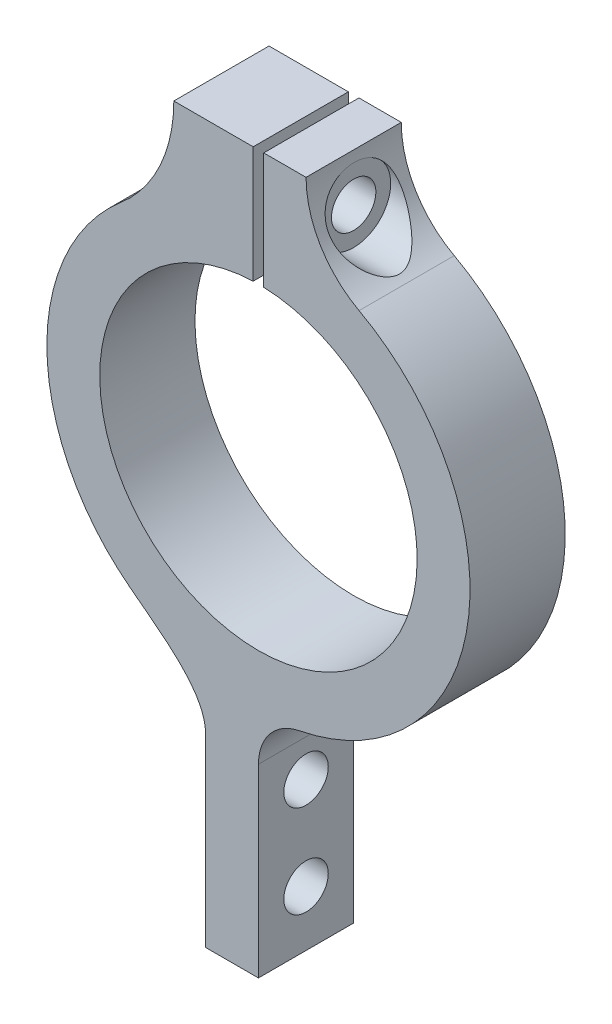
ISO-10303-21;
HEADER;
FILE_DESCRIPTION(('STEP AP214'),'2;1');
FILE_NAME('part.step','',(''),(''),'','','');
FILE_SCHEMA(('AUTOMOTIVE_DESIGN { 1 0 10303 214 1 1 1 1 }'));
ENDSEC;
DATA;
#1=APPLICATION_CONTEXT('core data for automotive mechanical design processes');
#2=APPLICATION_PROTOCOL_DEFINITION('international standard','automotive_design',2000,#1);
#3=PRODUCT_CONTEXT('',#1,'mechanical');
#4=PRODUCT('Part','Part','',(#3));
#5=PRODUCT_RELATED_PRODUCT_CATEGORY('part','',(#4));
#6=PRODUCT_DEFINITION_FORMATION('','',#4);
#7=PRODUCT_DEFINITION_CONTEXT('part definition',#1,'design');
#8=PRODUCT_DEFINITION('design','',#6,#7);
#9=PRODUCT_DEFINITION_SHAPE('','',#8);
#10=(LENGTH_UNIT() NAMED_UNIT(*) SI_UNIT(.MILLI.,.METRE.));
#11=(NAMED_UNIT(*) PLANE_ANGLE_UNIT() SI_UNIT($,.RADIAN.));
#12=(NAMED_UNIT(*) SI_UNIT($,.STERADIAN.) SOLID_ANGLE_UNIT());
#13=UNCERTAINTY_MEASURE_WITH_UNIT(LENGTH_MEASURE(1.E-05),#10,'distance_accuracy_value','');
#14=(GEOMETRIC_REPRESENTATION_CONTEXT(3) GLOBAL_UNCERTAINTY_ASSIGNED_CONTEXT((#13)) GLOBAL_UNIT_ASSIGNED_CONTEXT((#10,
#11,#12)) REPRESENTATION_CONTEXT('',''));
#15=CARTESIAN_POINT('',(0.,0.,0.));
#16=DIRECTION('',(0.,0.,1.));
#17=DIRECTION('',(1.,0.,0.));
#18=AXIS2_PLACEMENT_3D('',#15,#16,#17);
#19=CARTESIAN_POINT('',(28.1129032258065,52.,18.));
#20=DIRECTION('',(0.,0.,-1.));
#21=DIRECTION('',(-1.,0.,0.));
#22=AXIS2_PLACEMENT_3D('',#19,#20,#21);
#23=CYLINDRICAL_SURFACE('',#22,19.1129032258065);
#24=CARTESIAN_POINT('',(28.1129032258065,52.,0.));
#25=DIRECTION('',(0.,0.,-1.));
#26=DIRECTION('',(1.,0.,0.));
#27=AXIS2_PLACEMENT_3D('',#24,#25,#26);
#28=CIRCLE('',#27,19.1129032258065);
#29=CARTESIAN_POINT('',(19.0231923601637,35.1869031377899,0.));
#30=VERTEX_POINT('',#29);
#31=CARTESIAN_POINT('',(9.,52.,0.));
#32=VERTEX_POINT('',#31);
#33=EDGE_CURVE('E192',#30,#32,#28,.T.);
#34=ORIENTED_EDGE('',*,*,#33,.T.);
#35=DIRECTION('',(0.,0.,-1.));
#36=VECTOR('',#35,1.);
#37=CARTESIAN_POINT('',(9.,52.,18.));
#38=LINE('',#37,#36);
#39=CARTESIAN_POINT('',(9.,52.,18.));
#40=VERTEX_POINT('',#39);
#41=EDGE_CURVE('E218',#40,#32,#38,.T.);
#42=ORIENTED_EDGE('',*,*,#41,.F.);
#43=CARTESIAN_POINT('',(28.1129032258065,52.,18.));
#44=DIRECTION('',(0.,0.,-1.));
#45=DIRECTION('',(1.,0.,0.));
#46=AXIS2_PLACEMENT_3D('',#43,#44,#45);
#47=CIRCLE('',#46,19.1129032258065);
#48=CARTESIAN_POINT('',(19.0231923601637,35.1869031377899,18.));
#49=VERTEX_POINT('',#48);
#50=EDGE_CURVE('E327',#49,#40,#47,.T.);
#51=ORIENTED_EDGE('',*,*,#50,.F.);
#52=DIRECTION('',(0.,0.,-1.));
#53=VECTOR('',#52,1.);
#54=CARTESIAN_POINT('',(19.0231923601637,35.1869031377899,18.));
#55=LINE('',#54,#53);
#56=EDGE_CURVE('E221',#49,#30,#55,.T.);
#57=ORIENTED_EDGE('',*,*,#56,.T.);
#58=EDGE_LOOP('',(#34,#42,#51,#57));
#59=FACE_BOUND('',#58,.T.);
#60=CARTESIAN_POINT('',(17.6580923849044,36.,9.));
#61=CARTESIAN_POINT('',(17.6580901842161,36.0000010755365,8.88235732236984));
#62=CARTESIAN_POINT('',(17.6535371587383,36.002973632593,8.76467912745882));
#63=CARTESIAN_POINT('',(17.6354851467937,36.0147914781101,8.53026235110104));
#64=CARTESIAN_POINT('',(17.6219806304406,36.0236403967666,8.41352439564622));
#65=CARTESIAN_POINT('',(17.5864642358954,36.0470190077582,8.18167290114202));
#66=CARTESIAN_POINT('',(17.5644339522932,36.0615609910637,8.06656343880819));
#67=CARTESIAN_POINT('',(17.512568717232,36.0960085510067,7.83889149575266));
#68=CARTESIAN_POINT('',(17.4827293596723,36.1159171558351,7.72633049202438));
#69=CARTESIAN_POINT('',(17.4062616720574,36.1673250436832,7.47158695888006));
#70=CARTESIAN_POINT('',(17.3572771232616,36.2005110752184,7.3304506851968));
#71=CARTESIAN_POINT('',(17.2495002106957,36.2744217736509,7.05394997301961));
#72=CARTESIAN_POINT('',(17.1906998895253,36.3151525598523,6.91859033020005));
#73=CARTESIAN_POINT('',(17.0649892451219,36.4034436360839,6.65373386249375));
#74=CARTESIAN_POINT('',(16.9980653344239,36.4510153935157,6.52424737192376));
#75=CARTESIAN_POINT('',(16.8577664170625,36.5522668642214,6.2713959982453));
#76=CARTESIAN_POINT('',(16.7843930706783,36.6059450065683,6.14802955237135));
#77=CARTESIAN_POINT('',(16.5869619535518,36.752751243214,5.83500988027252));
#78=CARTESIAN_POINT('',(16.4588778191135,36.8502452943915,5.64993059203384));
#79=CARTESIAN_POINT('',(16.1936787939994,37.05799219418,5.2939175240548));
#80=CARTESIAN_POINT('',(16.0565584712705,37.1682527480078,5.12299239490636));
#81=CARTESIAN_POINT('',(15.7762000147324,37.4006159472294,4.79435722798566));
#82=CARTESIAN_POINT('',(15.6329549294902,37.5227322595644,4.63666284193071));
#83=CARTESIAN_POINT('',(15.3428275507618,37.7779895557299,4.33419288343536));
#84=CARTESIAN_POINT('',(15.195945952117,37.9111284446614,4.18941486698796));
#85=CARTESIAN_POINT('',(14.8915544317699,38.1961954860347,3.90426926188932));
#86=CARTESIAN_POINT('',(14.7339299173374,38.3487692858974,3.76466964529908));
#87=CARTESIAN_POINT('',(14.4183045731971,38.6654199953416,3.49963262572111));
#88=CARTESIAN_POINT('',(14.2603037147934,38.8294978111077,3.37419634043137));
#89=CARTESIAN_POINT('',(13.9455152442641,39.1687218688792,3.1379182261632));
#90=CARTESIAN_POINT('',(13.7887269728162,39.3438615397675,3.02706785111911));
#91=CARTESIAN_POINT('',(13.4776205933729,39.7049457043666,2.82052830141579));
#92=CARTESIAN_POINT('',(13.3233023759787,39.8908897178542,2.72483845361653));
#93=CARTESIAN_POINT('',(13.0196460542137,40.2715961632454,2.55024771855266));
#94=CARTESIAN_POINT('',(12.8702775970787,40.4662743018088,2.47121626422597));
#95=CARTESIAN_POINT('',(12.5764241674868,40.8652675781668,2.33009066481484));
#96=CARTESIAN_POINT('',(12.4319394005677,41.0695831207019,2.26799723181794));
#97=CARTESIAN_POINT('',(12.1491636081969,41.4868858519556,2.16210615525078));
#98=CARTESIAN_POINT('',(12.0108687137373,41.6998674603495,2.11829693634372));
#99=CARTESIAN_POINT('',(11.7415977901336,42.1334652014358,2.05037801304662));
#100=CARTESIAN_POINT('',(11.610620382729,42.3540798836641,2.02626458718918));
#101=CARTESIAN_POINT('',(11.3783240236921,42.7640475933536,2.00148797591833));
#102=CARTESIAN_POINT('',(11.2757042314319,42.9524707250311,1.99758187323488));
#103=CARTESIAN_POINT('',(11.0770039475465,43.3324088323346,2.00531686815198));
#104=CARTESIAN_POINT('',(10.9809222833666,43.5239232459043,2.01695517023872));
#105=CARTESIAN_POINT('',(10.7958985967472,43.9086487105881,2.05653278992353));
#106=CARTESIAN_POINT('',(10.7069542045307,44.1018591747295,2.08446667123787));
#107=CARTESIAN_POINT('',(10.5366556512286,44.4884620419484,2.15725451217697));
#108=CARTESIAN_POINT('',(10.4553015912212,44.6818544474141,2.20210869708437));
#109=CARTESIAN_POINT('',(10.3001239637233,45.068080318591,2.30945216492081));
#110=CARTESIAN_POINT('',(10.2263437525725,45.2609050259026,2.37203602054572));
#111=CARTESIAN_POINT('',(10.0870218333628,45.6429554686599,2.5149112360939));
#112=CARTESIAN_POINT('',(10.0214802357444,45.8321811558311,2.59520283335375));
#113=CARTESIAN_POINT('',(9.89865982124417,46.2049234372379,2.77335353838577));
#114=CARTESIAN_POINT('',(9.84137952945088,46.388441045951,2.87120950332814));
#115=CARTESIAN_POINT('',(9.7348848710466,46.7477039144138,3.08406405284738));
#116=CARTESIAN_POINT('',(9.6856698134005,46.923449839104,3.19906116714424));
#117=CARTESIAN_POINT('',(9.59921415895725,47.2489970685468,3.43381497979541));
#118=CARTESIAN_POINT('',(9.56128164189457,47.399681128527,3.55209656306455));
#119=CARTESIAN_POINT('',(9.49132078621771,47.6916050748106,3.80137746977728));
#120=CARTESIAN_POINT('',(9.4592922968812,47.8328452021469,3.93237646843104));
#121=CARTESIAN_POINT('',(9.40066346505474,48.1045571326457,4.20618170816906));
#122=CARTESIAN_POINT('',(9.37406241195237,48.2350303441831,4.34898640009303));
#123=CARTESIAN_POINT('',(9.32574401786717,48.4840630335401,4.64540217371016));
#124=CARTESIAN_POINT('',(9.30402670826509,48.6026224348043,4.79901332483245));
#125=CARTESIAN_POINT('',(9.26535060990003,48.8242785946145,5.11235565757578));
#126=CARTESIAN_POINT('',(9.24829585423533,48.9276629595022,5.27187173606287));
#127=CARTESIAN_POINT('',(9.21778146330255,49.1212754036867,5.59909717099794));
#128=CARTESIAN_POINT('',(9.20432303748869,49.2114990523826,5.76680926141082));
#129=CARTESIAN_POINT('',(9.18051298713507,49.3780262902558,6.10915190379966));
#130=CARTESIAN_POINT('',(9.17016039042411,49.4543342323196,6.28378027146164));
#131=CARTESIAN_POINT('',(9.15210240325127,49.5925195903312,6.63885768357837));
#132=CARTESIAN_POINT('',(9.14439794793474,49.6543919061149,6.81930875966575));
#133=CARTESIAN_POINT('',(9.13115744463525,49.7640445789032,7.18750071172405));
#134=CARTESIAN_POINT('',(9.12565596806724,49.8115975627345,7.3753105738621));
#135=CARTESIAN_POINT('',(9.11667431634353,49.8909826136002,7.75427194584981));
#136=CARTESIAN_POINT('',(9.11319416251163,49.9228145147859,7.94542349093037));
#137=CARTESIAN_POINT('',(9.10803796893861,49.9705311754312,8.32977346702599));
#138=CARTESIAN_POINT('',(9.10636232567179,49.9864124302762,8.52297233845279));
#139=CARTESIAN_POINT('',(9.10470704370399,50.0020986381108,8.90996673620945));
#140=CARTESIAN_POINT('',(9.10472686737902,50.0019086871987,9.10376205391791));
#141=CARTESIAN_POINT('',(9.10647087227074,49.985386069138,9.49255073887077));
#142=CARTESIAN_POINT('',(9.10821166960448,49.9688960236807,9.68753736364991));
#143=CARTESIAN_POINT('',(9.11353833364994,49.9196599054874,10.0754187340371));
#144=CARTESIAN_POINT('',(9.11712417260285,49.8869140773214,10.2683135110726));
#145=CARTESIAN_POINT('',(9.12636824118244,49.8054068250902,10.6506500559206));
#146=CARTESIAN_POINT('',(9.13202657863421,49.7566445677581,10.8400916435369));
#147=CARTESIAN_POINT('',(9.1457449499368,49.6434723505828,11.2141489234297));
#148=CARTESIAN_POINT('',(9.15380492796715,49.5790627544315,11.3987647277616));
#149=CARTESIAN_POINT('',(9.17273989372498,49.4351327177446,11.7617310068457));
#150=CARTESIAN_POINT('',(9.18361316668542,49.3556214898191,11.940085223232));
#151=CARTESIAN_POINT('',(9.20866286681949,49.1821211940099,12.2892813898708));
#152=CARTESIAN_POINT('',(9.22283802141064,49.0881377086154,12.4601262042532));
#153=CARTESIAN_POINT('',(9.25503649418175,48.8864234336076,12.793141021718));
#154=CARTESIAN_POINT('',(9.27306017819938,48.778691337456,12.9553101982683));
#155=CARTESIAN_POINT('',(9.31352246789939,48.5503934182944,13.2697635762989));
#156=CARTESIAN_POINT('',(9.33596101647602,48.4298277612943,13.4220479056047));
#157=CARTESIAN_POINT('',(9.38551933437672,48.1784332588251,13.7138594674856));
#158=CARTESIAN_POINT('',(9.41257969461673,48.0477449413501,13.8535178620048));
#159=CARTESIAN_POINT('',(9.47207704241666,47.7760201751177,14.1211319532272));
#160=CARTESIAN_POINT('',(9.50451397171938,47.6349838384944,14.2490877767091));
#161=CARTESIAN_POINT('',(9.57521358020898,47.3438687146599,14.4924301248725));
#162=CARTESIAN_POINT('',(9.61347514575994,47.193791659288,14.6078190450525));
#163=CARTESIAN_POINT('',(9.6961984575607,46.8859556017686,14.825364422272));
#164=CARTESIAN_POINT('',(9.74066015307694,46.7281966624861,14.9275209875743));
#165=CARTESIAN_POINT('',(9.83542831670913,46.4085416026135,15.116854161645));
#166=CARTESIAN_POINT('',(9.88565169970235,46.246725443378,15.204207521351));
#167=CARTESIAN_POINT('',(9.99253026980081,45.918475302548,15.365211707974));
#168=CARTESIAN_POINT('',(10.0491853671288,45.7520413854352,15.4388627261175));
#169=CARTESIAN_POINT('',(10.1689434082391,45.4159896604324,15.5723422568558));
#170=CARTESIAN_POINT('',(10.2320463515057,45.2463718527971,15.632170770556));
#171=CARTESIAN_POINT('',(10.3646030368729,44.9053269574933,15.7380721962035));
#172=CARTESIAN_POINT('',(10.4340573285119,44.7338997144042,15.7841439163965));
#173=CARTESIAN_POINT('',(10.581426250402,44.3850560548928,15.8640115153682));
#174=CARTESIAN_POINT('',(10.659540439746,44.2076234637414,15.8973675813909));
#175=CARTESIAN_POINT('',(10.8219770540319,43.8535351827961,15.9500735191975));
#176=CARTESIAN_POINT('',(10.906299577832,43.676879505421,15.9694231678975));
#177=CARTESIAN_POINT('',(11.0807650126027,43.3254490468986,15.9946499316714));
#178=CARTESIAN_POINT('',(11.1709093902944,43.1506747527758,16.0005236379812));
#179=CARTESIAN_POINT('',(11.3565383259361,42.8040239912164,15.9994030689073));
#180=CARTESIAN_POINT('',(11.4520234498026,42.6321478333933,15.9924074273466));
#181=CARTESIAN_POINT('',(11.659183607478,42.2724050343373,15.9646834753324));
#182=CARTESIAN_POINT('',(11.7714520260349,42.0849954491132,15.9424567211948));
#183=CARTESIAN_POINT('',(12.0012746733608,41.7157497756594,15.8837241844347));
#184=CARTESIAN_POINT('',(12.1188292614891,41.533914067765,15.8472174297402));
#185=CARTESIAN_POINT('',(12.3585051215781,41.1764922256395,15.7608159788059));
#186=CARTESIAN_POINT('',(12.4806275045959,41.0009076324505,15.710918006859));
#187=CARTESIAN_POINT('',(12.7286728508128,40.6565627779071,15.5985687137226));
#188=CARTESIAN_POINT('',(12.8545962976576,40.4878033914357,15.5361157892755));
#189=CARTESIAN_POINT('',(13.1331943396736,40.1268127749048,15.3866837054534));
#190=CARTESIAN_POINT('',(13.2864895024211,39.9360516351194,15.2973033718593));
#191=CARTESIAN_POINT('',(13.5960492798943,39.5652765363564,15.1029895466684));
#192=CARTESIAN_POINT('',(13.7523132503384,39.385260279898,14.99805939678));
#193=CARTESIAN_POINT('',(14.0667892547815,39.0360092975105,14.7732126378131));
#194=CARTESIAN_POINT('',(14.2250040444892,38.8667925885537,14.6532719249518));
#195=CARTESIAN_POINT('',(14.5416837649521,38.5398044273567,14.399032140431));
#196=CARTESIAN_POINT('',(14.7001486725623,38.3820319730498,14.2647343284425));
#197=CARTESIAN_POINT('',(15.0129224047312,38.0809537186052,13.9844300920289));
#198=CARTESIAN_POINT('',(15.1672552294794,37.9374417980192,13.8386720387986));
#199=CARTESIAN_POINT('',(15.472767520802,37.6622069494309,13.5332377896585));
#200=CARTESIAN_POINT('',(15.6239462287187,37.5304868331932,13.3735582919918));
#201=CARTESIAN_POINT('',(15.9204325488999,37.2797991033147,13.0401388344072));
#202=CARTESIAN_POINT('',(16.0657517882138,37.1608053731268,12.8664290056495));
#203=CARTESIAN_POINT('',(16.347606755101,36.9363585811639,12.5039505038252));
#204=CARTESIAN_POINT('',(16.4841485497689,36.8308961150603,12.315192438953));
#205=CARTESIAN_POINT('',(16.7574774804079,36.6250375380144,11.9014706224957));
#206=CARTESIAN_POINT('',(16.8928878828727,36.5262372932891,11.6747762441012));
#207=CARTESIAN_POINT('',(17.1398142662896,36.3501639382372,11.2007909564775));
#208=CARTESIAN_POINT('',(17.2513531235422,36.272870196535,10.9535200844148));
#209=CARTESIAN_POINT('',(17.4245860973591,36.1547403127534,10.4804477106735));
#210=CARTESIAN_POINT('',(17.4914063602804,36.1100443841642,10.2575673908491));
#211=CARTESIAN_POINT('',(17.5679665817325,36.0592256176079,9.91593353272351));
#212=CARTESIAN_POINT('',(17.5895324066883,36.0449960148583,9.80094857454984));
#213=CARTESIAN_POINT('',(17.6241604839674,36.0222095164915,9.56917490157863));
#214=CARTESIAN_POINT('',(17.6372281959941,36.013648978658,9.45238739432646));
#215=CARTESIAN_POINT('',(17.6498977845628,36.0053569809594,9.27944471985411));
#216=CARTESIAN_POINT('',(17.6529675234969,36.0033496991602,9.22362566105527));
#217=CARTESIAN_POINT('',(17.6570654690163,36.0006708730639,9.11187375370653));
#218=CARTESIAN_POINT('',(17.6580934313654,35.999999488566,9.05594089234459));
#219=CARTESIAN_POINT('',(17.6580923849044,36.,9.));
#220=B_SPLINE_CURVE_WITH_KNOTS('',3,(#60,#61,#62,#63,#64,#65,#66,#67,#68,#69,#70,#71,#72,#73,
#74,#75,#76,#77,#78,#79,#80,#81,#82,#83,#84,#85,#86,#87,#88,#89,#90,#91,#92,#93,#94,#95,#96,#97,
#98,#99,#100,#101,#102,#103,#104,#105,#106,#107,#108,#109,#110,#111,#112,#113,#114,#115,#116,
#117,#118,#119,#120,#121,#122,#123,#124,#125,#126,#127,#128,#129,#130,#131,#132,#133,#134,#135,
#136,#137,#138,#139,#140,#141,#142,#143,#144,#145,#146,#147,#148,#149,#150,#151,#152,#153,#154,
#155,#156,#157,#158,#159,#160,#161,#162,#163,#164,#165,#166,#167,#168,#169,#170,#171,#172,#173,
#174,#175,#176,#177,#178,#179,#180,#181,#182,#183,#184,#185,#186,#187,#188,#189,#190,#191,#192,
#193,#194,#195,#196,#197,#198,#199,#200,#201,#202,#203,#204,#205,#206,#207,#208,#209,#210,#211,
#212,#213,#214,#215,#216,#217,#218,#219),.UNSPECIFIED.,.T.,.F.,(4,2,2,2,2,2,2,2,2,2,2,2,2,2,2,2,
2,2,2,2,2,2,2,2,2,2,2,2,2,2,2,2,2,2,2,2,2,2,2,2,2,2,2,2,2,2,2,2,2,2,2,2,2,2,2,2,2,2,2,2,2,2,2,2,
2,2,2,2,2,2,2,2,2,2,2,2,2,2,2,4),(0.,0.352866236662386,0.70595066390632,1.05980161978727,
1.41385266046767,1.87224265053752,2.33100606672065,2.79054766371506,3.2499713053873,
3.98467826437169,4.71983098985473,5.45584147249893,6.19171239217291,6.97112910952103,
7.75060729154424,8.52962671446627,9.30861153857762,10.0812428795522,10.8539066975422,
11.6260806142187,12.3981085969271,13.0412466920351,13.6842691404266,14.3270771960056,
14.9698938104503,15.6162060411682,16.2625269349247,16.9087322961822,17.5548822611151,
18.1400105397797,18.7251238787937,19.3101605598833,19.8952010000489,20.4670943398871,
21.0391797674419,21.6110859363688,22.1831938570763,22.763957706771,23.3447276830754,
23.9256252360265,24.5063385899804,25.0927140748188,25.6790807378448,26.265477911877,
26.8518614575537,27.437888427718,28.0236899090869,28.609547101015,29.1953967154474,
29.7742157659106,30.353028545055,30.9317307972942,31.510428314487,32.0816367463399,
32.6528372059436,33.2240376198622,33.7952875026636,34.3848101918442,34.9743422703011,
35.5640234555274,36.1537672434052,36.811901219582,37.4700800042292,38.1284199369664,
38.7868439926656,39.5676922536484,40.348372950383,41.1303237387776,41.9122059761674,
42.680293820164,43.4485643301418,44.215226687568,44.9813532889208,45.8251007251881,
46.6680359344221,47.3757199912921,47.7288964067452,48.0818456954808,48.2496189197283,
48.4174122117105),.UNSPECIFIED.);
#221=CARTESIAN_POINT('',(17.6580923849044,36.,9.));
#222=VERTEX_POINT('',#221);
#223=EDGE_CURVE('E38',#222,#222,#220,.T.);
#224=ORIENTED_EDGE('',*,*,#223,.F.);
#225=EDGE_LOOP('',(#224));
#226=FACE_BOUND('',#225,.T.);
#227=ADVANCED_FACE('F33',(#59,#226),#23,.F.);
#228=CARTESIAN_POINT('',(1.,43.,9.));
#229=DIRECTION('',(-1.,0.,0.));
#230=DIRECTION('',(0.,0.,1.));
#231=AXIS2_PLACEMENT_3D('',#228,#229,#230);
#232=CYLINDRICAL_SURFACE('',#231,4.2);
#233=CARTESIAN_POINT('',(1.,43.,9.));
#234=DIRECTION('',(-1.,0.,0.));
#235=DIRECTION('',(0.,0.,1.));
#236=AXIS2_PLACEMENT_3D('',#233,#234,#235);
#237=CIRCLE('',#236,4.2);
#238=CARTESIAN_POINT('',(1.,43.,13.2));
#239=VERTEX_POINT('',#238);
#240=EDGE_CURVE('E179',#239,#239,#237,.T.);
#241=ORIENTED_EDGE('',*,*,#240,.T.);
#242=EDGE_LOOP('',(#241));
#243=FACE_BOUND('',#242,.T.);
#244=CARTESIAN_POINT('',(9.,43.,9.));
#245=DIRECTION('',(1.,0.,0.));
#246=DIRECTION('',(0.,1.,0.));
#247=AXIS2_PLACEMENT_3D('',#244,#245,#246);
#248=CIRCLE('',#247,4.2);
#249=CARTESIAN_POINT('',(9.,47.2,9.));
#250=VERTEX_POINT('',#249);
#251=EDGE_CURVE('E243',#250,#250,#248,.F.);
#252=ORIENTED_EDGE('',*,*,#251,.F.);
#253=EDGE_LOOP('',(#252));
#254=FACE_BOUND('',#253,.T.);
#255=ADVANCED_FACE('F256',(#243,#254),#232,.F.);
#256=CARTESIAN_POINT('',(-26.5352300309959,-29.9312807477751,18.));
#257=CARTESIAN_POINT('',(-20.9482126288613,-34.8843862697912,18.));
#258=CARTESIAN_POINT('',(-10.,-40.9040227720652,18.));
#259=CARTESIAN_POINT('',(-10.,-48.6004115208915,18.));
#260=B_SPLINE_CURVE_WITH_KNOTS('',3,(#256,#257,#258,#259),.UNSPECIFIED.,.F.,.F.,(4,4),(0.,1.),.UNSPECIFIED.);
#261=DIRECTION('',(0.,0.,-1.));
#262=VECTOR('',#261,1.);
#263=SURFACE_OF_LINEAR_EXTRUSION('',#260,#262);
#264=CARTESIAN_POINT('',(-26.5352300309959,-29.9312807477751,0.));
#265=CARTESIAN_POINT('',(-20.9482126288613,-34.8843862697912,0.));
#266=CARTESIAN_POINT('',(-10.,-40.9040227720652,0.));
#267=CARTESIAN_POINT('',(-10.,-48.6004115208915,0.));
#268=B_SPLINE_CURVE_WITH_KNOTS('',3,(#264,#265,#266,#267),.UNSPECIFIED.,.F.,.F.,(4,4),(0.,1.),.UNSPECIFIED.);
#269=CARTESIAN_POINT('',(-26.5352300309959,-29.9312807477751,0.));
#270=VERTEX_POINT('',#269);
#271=CARTESIAN_POINT('',(-10.,-48.6004115208915,0.));
#272=VERTEX_POINT('',#271);
#273=EDGE_CURVE('E173',#270,#272,#268,.T.);
#274=ORIENTED_EDGE('',*,*,#273,.T.);
#275=DIRECTION('',(0.,0.,-1.));
#276=VECTOR('',#275,1.);
#277=CARTESIAN_POINT('',(-10.,-48.6004115208915,18.));
#278=LINE('',#277,#276);
#279=CARTESIAN_POINT('',(-10.,-48.6004115208915,18.));
#280=VERTEX_POINT('',#279);
#281=EDGE_CURVE('E11',#280,#272,#278,.T.);
#282=ORIENTED_EDGE('',*,*,#281,.F.);
#283=CARTESIAN_POINT('',(-26.5352300309959,-29.9312807477751,18.));
#284=VERTEX_POINT('',#283);
#285=EDGE_CURVE('E205',#284,#280,#260,.T.);
#286=ORIENTED_EDGE('',*,*,#285,.F.);
#287=DIRECTION('',(0.,0.,-1.));
#288=VECTOR('',#287,1.);
#289=CARTESIAN_POINT('',(-26.5352300309959,-29.9312807477751,18.));
#290=LINE('',#289,#288);
#291=EDGE_CURVE('E169',#284,#270,#290,.T.);
#292=ORIENTED_EDGE('',*,*,#291,.T.);
#293=EDGE_LOOP('',(#274,#282,#286,#292));
#294=FACE_BOUND('',#293,.T.);
#295=ADVANCED_FACE('F35',(#294),#263,.F.);
#296=CARTESIAN_POINT('',(-9.99999999999999,-83.6004115208915,18.));
#297=DIRECTION('',(1.,0.,0.));
#298=DIRECTION('',(0.,1.,0.));
#299=AXIS2_PLACEMENT_3D('',#296,#297,#298);
#300=PLANE('',#299);
#301=CARTESIAN_POINT('',(-10.,-55.6004115208915,9.));
#302=DIRECTION('',(1.,0.,0.));
#303=DIRECTION('',(0.,1.,0.));
#304=AXIS2_PLACEMENT_3D('',#301,#302,#303);
#305=CIRCLE('',#304,4.19999999999999);
#306=CARTESIAN_POINT('',(-10.,-51.4004115208915,9.));
#307=VERTEX_POINT('',#306);
#308=EDGE_CURVE('E305',#307,#307,#305,.T.);
#309=ORIENTED_EDGE('',*,*,#308,.T.);
#310=EDGE_LOOP('',(#309));
#311=FACE_BOUND('',#310,.T.);
#312=CARTESIAN_POINT('',(-9.99999999999999,-73.1004115208915,9.));
#313=DIRECTION('',(1.,0.,0.));
#314=DIRECTION('',(0.,1.,0.));
#315=AXIS2_PLACEMENT_3D('',#312,#313,#314);
#316=CIRCLE('',#315,4.19999999999999);
#317=CARTESIAN_POINT('',(-9.99999999999999,-68.9004115208915,9.));
#318=VERTEX_POINT('',#317);
#319=EDGE_CURVE('E242',#318,#318,#316,.T.);
#320=ORIENTED_EDGE('',*,*,#319,.T.);
#321=EDGE_LOOP('',(#320));
#322=FACE_BOUND('',#321,.T.);
#323=DIRECTION('',(0.,-1.,0.));
#324=VECTOR('',#323,1.);
#325=CARTESIAN_POINT('',(-9.99999999999999,-83.6004115208915,0.));
#326=LINE('',#325,#324);
#327=CARTESIAN_POINT('',(-9.99999999999999,-83.6004115208915,0.));
#328=VERTEX_POINT('',#327);
#329=EDGE_CURVE('E178',#272,#328,#326,.T.);
#330=ORIENTED_EDGE('',*,*,#329,.T.);
#331=DIRECTION('',(0.,0.,-1.));
#332=VECTOR('',#331,1.);
#333=CARTESIAN_POINT('',(-9.99999999999999,-83.6004115208915,18.));
#334=LINE('',#333,#332);
#335=CARTESIAN_POINT('',(-9.99999999999999,-83.6004115208915,18.));
#336=VERTEX_POINT('',#335);
#337=EDGE_CURVE('E48',#336,#328,#334,.T.);
#338=ORIENTED_EDGE('',*,*,#337,.F.);
#339=DIRECTION('',(0.,-1.,0.));
#340=VECTOR('',#339,1.);
#341=CARTESIAN_POINT('',(-9.99999999999999,-83.6004115208915,18.));
#342=LINE('',#341,#340);
#343=EDGE_CURVE('E118',#280,#336,#342,.T.);
#344=ORIENTED_EDGE('',*,*,#343,.F.);
#345=ORIENTED_EDGE('',*,*,#281,.T.);
#346=EDGE_LOOP('',(#330,#338,#344,#345));
#347=FACE_BOUND('',#346,.T.);
#348=ADVANCED_FACE('F294',(#311,#322,#347),#300,.F.);
#349=CARTESIAN_POINT('',(0.,-83.6004115208915,18.));
#350=DIRECTION('',(0.,1.,0.));
#351=DIRECTION('',(0.,0.,1.));
#352=AXIS2_PLACEMENT_3D('',#349,#350,#351);
#353=PLANE('',#352);
#354=DIRECTION('',(1.,0.,0.));
#355=VECTOR('',#354,1.);
#356=CARTESIAN_POINT('',(0.,-83.6004115208915,0.));
#357=LINE('',#356,#355);
#358=CARTESIAN_POINT('',(0.,-83.6004115208915,0.));
#359=VERTEX_POINT('',#358);
#360=EDGE_CURVE('E184',#328,#359,#357,.T.);
#361=ORIENTED_EDGE('',*,*,#360,.T.);
#362=DIRECTION('',(0.,0.,-1.));
#363=VECTOR('',#362,1.);
#364=CARTESIAN_POINT('',(0.,-83.6004115208915,18.));
#365=LINE('',#364,#363);
#366=CARTESIAN_POINT('',(0.,-83.6004115208915,18.));
#367=VERTEX_POINT('',#366);
#368=EDGE_CURVE('E230',#367,#359,#365,.T.);
#369=ORIENTED_EDGE('',*,*,#368,.F.);
#370=DIRECTION('',(1.,0.,0.));
#371=VECTOR('',#370,1.);
#372=CARTESIAN_POINT('',(0.,-83.6004115208915,18.));
#373=LINE('',#372,#371);
#374=EDGE_CURVE('E313',#336,#367,#373,.T.);
#375=ORIENTED_EDGE('',*,*,#374,.F.);
#376=ORIENTED_EDGE('',*,*,#337,.T.);
#377=EDGE_LOOP('',(#361,#369,#375,#376));
#378=FACE_BOUND('',#377,.T.);
#379=ADVANCED_FACE('F291',(#378),#353,.F.);
#380=CARTESIAN_POINT('',(0.,-48.6004115208915,18.));
#381=DIRECTION('',(-1.,0.,0.));
#382=DIRECTION('',(0.,-1.,0.));
#383=AXIS2_PLACEMENT_3D('',#380,#381,#382);
#384=PLANE('',#383);
#385=CARTESIAN_POINT('',(0.,-55.6004115208915,9.));
#386=DIRECTION('',(1.,0.,0.));
#387=DIRECTION('',(0.,0.,-1.));
#388=AXIS2_PLACEMENT_3D('',#385,#386,#387);
#389=CIRCLE('',#388,4.19999999999999);
#390=CARTESIAN_POINT('',(0.,-55.6004115208915,4.80000000000001));
#391=VERTEX_POINT('',#390);
#392=EDGE_CURVE('E366',#391,#391,#389,.T.);
#393=ORIENTED_EDGE('',*,*,#392,.F.);
#394=EDGE_LOOP('',(#393));
#395=FACE_BOUND('',#394,.T.);
#396=CARTESIAN_POINT('',(0.,-73.1004115208915,9.));
#397=DIRECTION('',(1.,0.,0.));
#398=DIRECTION('',(0.,0.,-1.));
#399=AXIS2_PLACEMENT_3D('',#396,#397,#398);
#400=CIRCLE('',#399,4.19999999999998);
#401=CARTESIAN_POINT('',(0.,-73.1004115208915,4.80000000000001));
#402=VERTEX_POINT('',#401);
#403=EDGE_CURVE('E362',#402,#402,#400,.T.);
#404=ORIENTED_EDGE('',*,*,#403,.F.);
#405=EDGE_LOOP('',(#404));
#406=FACE_BOUND('',#405,.T.);
#407=DIRECTION('',(0.,1.,0.));
#408=VECTOR('',#407,1.);
#409=CARTESIAN_POINT('',(0.,-48.6004115208915,0.));
#410=LINE('',#409,#408);
#411=CARTESIAN_POINT('',(0.,-48.6004115208915,0.));
#412=VERTEX_POINT('',#411);
#413=EDGE_CURVE('E186',#359,#412,#410,.T.);
#414=ORIENTED_EDGE('',*,*,#413,.T.);
#415=DIRECTION('',(0.,0.,-1.));
#416=VECTOR('',#415,1.);
#417=CARTESIAN_POINT('',(0.,-48.6004115208915,18.));
#418=LINE('',#417,#416);
#419=CARTESIAN_POINT('',(0.,-48.6004115208915,18.));
#420=VERTEX_POINT('',#419);
#421=EDGE_CURVE('E227',#420,#412,#418,.T.);
#422=ORIENTED_EDGE('',*,*,#421,.F.);
#423=DIRECTION('',(0.,1.,0.));
#424=VECTOR('',#423,1.);
#425=CARTESIAN_POINT('',(0.,-48.6004115208915,18.));
#426=LINE('',#425,#424);
#427=EDGE_CURVE('E325',#367,#420,#426,.T.);
#428=ORIENTED_EDGE('',*,*,#427,.F.);
#429=ORIENTED_EDGE('',*,*,#368,.T.);
#430=EDGE_LOOP('',(#414,#422,#428,#429));
#431=FACE_BOUND('',#430,.T.);
#432=ADVANCED_FACE('F287',(#395,#406,#431),#384,.F.);
#433=CARTESIAN_POINT('',(9.525,-48.6004115208915,18.));
#434=DIRECTION('',(0.,0.,-1.));
#435=DIRECTION('',(-1.,0.,0.));
#436=AXIS2_PLACEMENT_3D('',#433,#434,#435);
#437=CYLINDRICAL_SURFACE('',#436,9.525);
#438=CARTESIAN_POINT('',(9.525,-48.6004115208915,0.));
#439=DIRECTION('',(0.,0.,-1.));
#440=DIRECTION('',(-1.,0.,0.));
#441=AXIS2_PLACEMENT_3D('',#438,#439,#440);
#442=CIRCLE('',#441,9.525);
#443=CARTESIAN_POINT('',(7.69308430085814,-39.2532349487261,0.));
#444=VERTEX_POINT('',#443);
#445=EDGE_CURVE('E188',#412,#444,#442,.T.);
#446=ORIENTED_EDGE('',*,*,#445,.T.);
#447=DIRECTION('',(0.,0.,-1.));
#448=VECTOR('',#447,1.);
#449=CARTESIAN_POINT('',(7.69308430085814,-39.2532349487261,18.));
#450=LINE('',#449,#448);
#451=CARTESIAN_POINT('',(7.69308430085814,-39.2532349487261,18.));
#452=VERTEX_POINT('',#451);
#453=EDGE_CURVE('E224',#452,#444,#450,.T.);
#454=ORIENTED_EDGE('',*,*,#453,.F.);
#455=CARTESIAN_POINT('',(9.525,-48.6004115208915,18.));
#456=DIRECTION('',(0.,0.,-1.));
#457=DIRECTION('',(-1.,0.,0.));
#458=AXIS2_PLACEMENT_3D('',#455,#456,#457);
#459=CIRCLE('',#458,9.525);
#460=EDGE_CURVE('E322',#420,#452,#459,.T.);
#461=ORIENTED_EDGE('',*,*,#460,.F.);
#462=ORIENTED_EDGE('',*,*,#421,.T.);
#463=EDGE_LOOP('',(#446,#454,#461,#462));
#464=FACE_BOUND('',#463,.T.);
#465=ADVANCED_FACE('F283',(#464),#437,.F.);
#466=CARTESIAN_POINT('',(0.,0.,18.));
#467=DIRECTION('',(0.,0.,-1.));
#468=DIRECTION('',(-1.,0.,0.));
#469=AXIS2_PLACEMENT_3D('',#466,#467,#468);
#470=CYLINDRICAL_SURFACE('',#469,40.);
#471=CARTESIAN_POINT('',(0.,0.,0.));
#472=DIRECTION('',(0.,0.,1.));
#473=DIRECTION('',(1.,0.,0.));
#474=AXIS2_PLACEMENT_3D('',#471,#472,#473);
#475=CIRCLE('',#474,40.);
#476=EDGE_CURVE('E190',#444,#30,#475,.T.);
#477=ORIENTED_EDGE('',*,*,#476,.T.);
#478=ORIENTED_EDGE('',*,*,#56,.F.);
#479=CARTESIAN_POINT('',(0.,0.,18.));
#480=DIRECTION('',(0.,0.,1.));
#481=DIRECTION('',(1.,0.,0.));
#482=AXIS2_PLACEMENT_3D('',#479,#480,#481);
#483=CIRCLE('',#482,40.);
#484=EDGE_CURVE('E324',#452,#49,#483,.T.);
#485=ORIENTED_EDGE('',*,*,#484,.F.);
#486=ORIENTED_EDGE('',*,*,#453,.T.);
#487=EDGE_LOOP('',(#477,#478,#485,#486));
#488=FACE_BOUND('',#487,.T.);
#489=ADVANCED_FACE('F280',(#488),#470,.T.);
#490=CARTESIAN_POINT('',(1.,52.,18.));
#491=DIRECTION('',(0.,-1.,0.));
#492=DIRECTION('',(0.,0.,-1.));
#493=AXIS2_PLACEMENT_3D('',#490,#491,#492);
#494=PLANE('',#493);
#495=DIRECTION('',(-1.,0.,0.));
#496=VECTOR('',#495,1.);
#497=CARTESIAN_POINT('',(1.,52.,0.));
#498=LINE('',#497,#496);
#499=CARTESIAN_POINT('',(1.,52.,0.));
#500=VERTEX_POINT('',#499);
#501=EDGE_CURVE('E194',#32,#500,#498,.T.);
#502=ORIENTED_EDGE('',*,*,#501,.T.);
#503=DIRECTION('',(0.,0.,-1.));
#504=VECTOR('',#503,1.);
#505=CARTESIAN_POINT('',(1.,52.,18.));
#506=LINE('',#505,#504);
#507=CARTESIAN_POINT('',(1.,52.,18.));
#508=VERTEX_POINT('',#507);
#509=EDGE_CURVE('E215',#508,#500,#506,.T.);
#510=ORIENTED_EDGE('',*,*,#509,.F.);
#511=DIRECTION('',(-1.,0.,0.));
#512=VECTOR('',#511,1.);
#513=CARTESIAN_POINT('',(1.,52.,18.));
#514=LINE('',#513,#512);
#515=EDGE_CURVE('E333',#40,#508,#514,.T.);
#516=ORIENTED_EDGE('',*,*,#515,.F.);
#517=ORIENTED_EDGE('',*,*,#41,.T.);
#518=EDGE_LOOP('',(#502,#510,#516,#517));
#519=FACE_BOUND('',#518,.T.);
#520=ADVANCED_FACE('F278',(#519),#494,.F.);
#521=CARTESIAN_POINT('',(1.,52.,18.));
#522=DIRECTION('',(1.,0.,0.));
#523=DIRECTION('',(0.,1.,0.));
#524=AXIS2_PLACEMENT_3D('',#521,#522,#523);
#525=PLANE('',#524);
#526=ORIENTED_EDGE('',*,*,#240,.F.);
#527=EDGE_LOOP('',(#526));
#528=FACE_BOUND('',#527,.T.);
#529=DIRECTION('',(0.,-1.,0.));
#530=VECTOR('',#529,1.);
#531=CARTESIAN_POINT('',(1.,52.,0.));
#532=LINE('',#531,#530);
#533=CARTESIAN_POINT('',(1.00000000000001,29.9833287011299,0.));
#534=VERTEX_POINT('',#533);
#535=EDGE_CURVE('E196',#500,#534,#532,.T.);
#536=ORIENTED_EDGE('',*,*,#535,.T.);
#537=DIRECTION('',(0.,0.,-1.));
#538=VECTOR('',#537,1.);
#539=CARTESIAN_POINT('',(1.00000000000001,29.9833287011299,18.));
#540=LINE('',#539,#538);
#541=CARTESIAN_POINT('',(1.00000000000001,29.9833287011299,18.));
#542=VERTEX_POINT('',#541);
#543=EDGE_CURVE('E212',#542,#534,#540,.T.);
#544=ORIENTED_EDGE('',*,*,#543,.F.);
#545=DIRECTION('',(0.,-1.,0.));
#546=VECTOR('',#545,1.);
#547=CARTESIAN_POINT('',(1.,52.,18.));
#548=LINE('',#547,#546);
#549=EDGE_CURVE('E335',#508,#542,#548,.T.);
#550=ORIENTED_EDGE('',*,*,#549,.F.);
#551=ORIENTED_EDGE('',*,*,#509,.T.);
#552=EDGE_LOOP('',(#536,#544,#550,#551));
#553=FACE_BOUND('',#552,.T.);
#554=ADVANCED_FACE('F440',(#528,#553),#525,.F.);
#555=CARTESIAN_POINT('',(0.,0.,18.));
#556=DIRECTION('',(0.,0.,-1.));
#557=DIRECTION('',(-1.,0.,0.));
#558=AXIS2_PLACEMENT_3D('',#555,#556,#557);
#559=CYLINDRICAL_SURFACE('',#558,30.);
#560=CARTESIAN_POINT('',(0.,0.,0.));
#561=DIRECTION('',(0.,0.,-1.));
#562=DIRECTION('',(1.,0.,0.));
#563=AXIS2_PLACEMENT_3D('',#560,#561,#562);
#564=CIRCLE('',#563,30.);
#565=CARTESIAN_POINT('',(-0.999999999999998,29.9833287011299,0.));
#566=VERTEX_POINT('',#565);
#567=EDGE_CURVE('E198',#534,#566,#564,.T.);
#568=ORIENTED_EDGE('',*,*,#567,.T.);
#569=DIRECTION('',(0.,0.,-1.));
#570=VECTOR('',#569,1.);
#571=CARTESIAN_POINT('',(-0.999999999999998,29.9833287011299,18.));
#572=LINE('',#571,#570);
#573=CARTESIAN_POINT('',(-0.999999999999998,29.9833287011299,18.));
#574=VERTEX_POINT('',#573);
#575=EDGE_CURVE('E209',#574,#566,#572,.T.);
#576=ORIENTED_EDGE('',*,*,#575,.F.);
#577=CARTESIAN_POINT('',(0.,0.,18.));
#578=DIRECTION('',(0.,0.,-1.));
#579=DIRECTION('',(1.,0.,0.));
#580=AXIS2_PLACEMENT_3D('',#577,#578,#579);
#581=CIRCLE('',#580,30.);
#582=EDGE_CURVE('E337',#542,#574,#581,.T.);
#583=ORIENTED_EDGE('',*,*,#582,.F.);
#584=ORIENTED_EDGE('',*,*,#543,.T.);
#585=EDGE_LOOP('',(#568,#576,#583,#584));
#586=FACE_BOUND('',#585,.T.);
#587=ADVANCED_FACE('F343',(#586),#559,.F.);
#588=CARTESIAN_POINT('',(-1.,52.,18.));
#589=DIRECTION('',(-1.,0.,0.));
#590=DIRECTION('',(0.,-1.,0.));
#591=AXIS2_PLACEMENT_3D('',#588,#589,#590);
#592=PLANE('',#591);
#593=CARTESIAN_POINT('',(-0.999999999999999,43.,9.));
#594=DIRECTION('',(-1.,0.,0.));
#595=DIRECTION('',(0.,-1.,0.));
#596=AXIS2_PLACEMENT_3D('',#593,#594,#595);
#597=CIRCLE('',#596,4.19999999999999);
#598=CARTESIAN_POINT('',(-0.999999999999999,38.8,9.));
#599=VERTEX_POINT('',#598);
#600=EDGE_CURVE('E241',#599,#599,#597,.T.);
#601=ORIENTED_EDGE('',*,*,#600,.T.);
#602=EDGE_LOOP('',(#601));
#603=FACE_BOUND('',#602,.T.);
#604=DIRECTION('',(0.,1.,0.));
#605=VECTOR('',#604,1.);
#606=CARTESIAN_POINT('',(-1.,52.,0.));
#607=LINE('',#606,#605);
#608=CARTESIAN_POINT('',(-1.,52.,0.));
#609=VERTEX_POINT('',#608);
#610=EDGE_CURVE('E200',#566,#609,#607,.T.);
#611=ORIENTED_EDGE('',*,*,#610,.T.);
#612=DIRECTION('',(0.,0.,-1.));
#613=VECTOR('',#612,1.);
#614=CARTESIAN_POINT('',(-1.,52.,18.));
#615=LINE('',#614,#613);
#616=CARTESIAN_POINT('',(-1.,52.,18.));
#617=VERTEX_POINT('',#616);
#618=EDGE_CURVE('E164',#617,#609,#615,.T.);
#619=ORIENTED_EDGE('',*,*,#618,.F.);
#620=DIRECTION('',(0.,1.,0.));
#621=VECTOR('',#620,1.);
#622=CARTESIAN_POINT('',(-1.,52.,18.));
#623=LINE('',#622,#621);
#624=EDGE_CURVE('E155',#574,#617,#623,.T.);
#625=ORIENTED_EDGE('',*,*,#624,.F.);
#626=ORIENTED_EDGE('',*,*,#575,.T.);
#627=EDGE_LOOP('',(#611,#619,#625,#626));
#628=FACE_BOUND('',#627,.T.);
#629=ADVANCED_FACE('F347',(#603,#628),#592,.F.);
#630=CARTESIAN_POINT('',(-1.,52.,18.));
#631=DIRECTION('',(0.,-1.,0.));
#632=DIRECTION('',(0.,0.,-1.));
#633=AXIS2_PLACEMENT_3D('',#630,#631,#632);
#634=PLANE('',#633);
#635=DIRECTION('',(-1.,0.,0.));
#636=VECTOR('',#635,1.);
#637=CARTESIAN_POINT('',(-1.,52.,0.));
#638=LINE('',#637,#636);
#639=CARTESIAN_POINT('',(-16.,52.,0.));
#640=VERTEX_POINT('',#639);
#641=EDGE_CURVE('E163',#609,#640,#638,.T.);
#642=ORIENTED_EDGE('',*,*,#641,.T.);
#643=DIRECTION('',(0.,0.,-1.));
#644=VECTOR('',#643,1.);
#645=CARTESIAN_POINT('',(-16.,52.,18.));
#646=LINE('',#645,#644);
#647=CARTESIAN_POINT('',(-16.,52.,18.));
#648=VERTEX_POINT('',#647);
#649=EDGE_CURVE('E160',#648,#640,#646,.T.);
#650=ORIENTED_EDGE('',*,*,#649,.F.);
#651=DIRECTION('',(-1.,0.,0.));
#652=VECTOR('',#651,1.);
#653=CARTESIAN_POINT('',(-1.,52.,18.));
#654=LINE('',#653,#652);
#655=EDGE_CURVE('E149',#617,#648,#654,.T.);
#656=ORIENTED_EDGE('',*,*,#655,.F.);
#657=ORIENTED_EDGE('',*,*,#618,.T.);
#658=EDGE_LOOP('',(#642,#650,#656,#657));
#659=FACE_BOUND('',#658,.T.);
#660=ADVANCED_FACE('F161',(#659),#634,.F.);
#661=CARTESIAN_POINT('',(-44.3333333333333,52.,18.));
#662=DIRECTION('',(0.,0.,-1.));
#663=DIRECTION('',(-1.,0.,0.));
#664=AXIS2_PLACEMENT_3D('',#661,#662,#663);
#665=CYLINDRICAL_SURFACE('',#664,28.3333333333333);
#666=CARTESIAN_POINT('',(-17.4674110938535,43.,4.80000000000001));
#667=CARTESIAN_POINT('',(-17.388218437458,43.2364077454225,4.80000694891413));
#668=CARTESIAN_POINT('',(-17.3121361857054,43.4739693805621,4.82000519046075));
#669=CARTESIAN_POINT('',(-17.1680712284813,43.944753682469,4.90066966218323));
#670=CARTESIAN_POINT('',(-17.1000923715462,44.1779742435152,4.96135512597869));
#671=CARTESIAN_POINT('',(-16.9734258295955,44.633238710482,5.12302223193914));
#672=CARTESIAN_POINT('',(-16.9147543514321,44.8552626712451,5.2240731089089));
#673=CARTESIAN_POINT('',(-16.8075214345483,45.2802134683643,5.46444023563026));
#674=CARTESIAN_POINT('',(-16.7589576022309,45.4831448197998,5.60374740772234));
#675=CARTESIAN_POINT('',(-16.673500464268,45.8561541502749,5.91150440664498));
#676=CARTESIAN_POINT('',(-16.6362592940731,46.0271308949226,6.07876881733093));
#677=CARTESIAN_POINT('',(-16.5708564963273,46.338896103705,6.44093007254733));
#678=CARTESIAN_POINT('',(-16.5426937914009,46.4796881493069,6.63582363426735));
#679=CARTESIAN_POINT('',(-16.4954420315791,46.723197701026,7.04231667334589));
#680=CARTESIAN_POINT('',(-16.4761418434516,46.8267867407675,7.25337014218427));
#681=CARTESIAN_POINT('',(-16.4449874479141,46.997449213008,7.69027062816263));
#682=CARTESIAN_POINT('',(-16.4331328221083,47.0645246973202,7.91611681325347));
#683=CARTESIAN_POINT('',(-16.416473191519,47.1596453664576,8.37419598512123));
#684=CARTESIAN_POINT('',(-16.4116113035605,47.1880053890292,8.6063616005137));
#685=CARTESIAN_POINT('',(-16.4085428000486,47.2058431580863,9.07222500807256));
#686=CARTESIAN_POINT('',(-16.4103360882294,47.1953214669878,9.30592277802783));
#687=CARTESIAN_POINT('',(-16.4206498895341,47.1357658136136,9.76784853936621));
#688=CARTESIAN_POINT('',(-16.4291603344769,47.086789490613,9.99608419068824));
#689=CARTESIAN_POINT('',(-16.4532462283329,46.9519136130095,10.4409739563159));
#690=CARTESIAN_POINT('',(-16.4688215766671,46.8660145840543,10.6576282354496));
#691=CARTESIAN_POINT('',(-16.5075869932562,46.6599096017653,11.0733857245588));
#692=CARTESIAN_POINT('',(-16.5307820353181,46.5396812464527,11.2724773624304));
#693=CARTESIAN_POINT('',(-16.5853699052757,46.2687404529722,11.6474203969525));
#694=CARTESIAN_POINT('',(-16.6167626363408,46.118028374881,11.8232720680752));
#695=CARTESIAN_POINT('',(-16.6883942598439,45.7900591610501,12.1478671024236));
#696=CARTESIAN_POINT('',(-16.728676819542,45.61267241854,12.2964697790078));
#697=CARTESIAN_POINT('',(-16.8181799525602,45.2375112962022,12.5617893248249));
#698=CARTESIAN_POINT('',(-16.8674009707143,45.0397359019186,12.6785046064158));
#699=CARTESIAN_POINT('',(-16.9755021616968,44.6261762278739,12.8793459173472));
#700=CARTESIAN_POINT('',(-17.0345379471776,44.4101350600403,12.9628582447209));
#701=CARTESIAN_POINT('',(-17.1608782197461,43.9695582811347,13.0930128822841));
#702=CARTESIAN_POINT('',(-17.2281841044045,43.7450212387875,13.1396489507976));
#703=CARTESIAN_POINT('',(-17.3725270682996,43.2848978305965,13.1969776177008));
#704=CARTESIAN_POINT('',(-17.4498383317665,43.0492179294785,13.2062233579327));
#705=CARTESIAN_POINT('',(-17.6101003005487,42.5815191402499,13.1856563430846));
#706=CARTESIAN_POINT('',(-17.6930525173828,42.3495012540756,13.1558330798803));
#707=CARTESIAN_POINT('',(-17.8665974197078,41.8829486238193,13.056103875445));
#708=CARTESIAN_POINT('',(-17.9573634644568,41.6489023214673,12.9842081245988));
#709=CARTESIAN_POINT('',(-18.1392568508187,41.196870257139,12.8010888784653));
#710=CARTESIAN_POINT('',(-18.230384298519,40.978889646035,12.6898528358732));
#711=CARTESIAN_POINT('',(-18.4121178320089,40.5578634739251,12.4262893266234));
#712=CARTESIAN_POINT('',(-18.5026179047783,40.3555008501934,12.272782388078));
#713=CARTESIAN_POINT('',(-18.6320330109374,40.0739053622172,12.0156590595675));
#714=CARTESIAN_POINT('',(-18.6741394638945,39.9836495826877,11.92541041181));
#715=CARTESIAN_POINT('',(-18.7556084867832,39.811200724805,11.7364017821605));
#716=CARTESIAN_POINT('',(-18.7949724245506,39.7290036187181,11.6376460989409));
#717=CARTESIAN_POINT('',(-18.8689731492995,39.5761880116072,11.435770959888));
#718=CARTESIAN_POINT('',(-18.903727038955,39.505265325259,11.3329244880473));
#719=CARTESIAN_POINT('',(-18.9694259734013,39.3724321973833,11.1204795392005));
#720=CARTESIAN_POINT('',(-19.000372929698,39.3105172300982,11.0108844925579));
#721=CARTESIAN_POINT('',(-19.0578462488854,39.1964218677884,10.7856979606512));
#722=CARTESIAN_POINT('',(-19.0843748379801,39.144236568856,10.6701095338986));
#723=CARTESIAN_POINT('',(-19.1324433759101,39.0502620369736,10.4337828590816));
#724=CARTESIAN_POINT('',(-19.1539839666368,39.0084714663044,10.3130452760181));
#725=CARTESIAN_POINT('',(-19.1896150095806,38.9396574417736,10.0801840361543));
#726=CARTESIAN_POINT('',(-19.2042456394987,38.9115535965615,9.9684613149336));
#727=CARTESIAN_POINT('',(-19.2287780165052,38.8645599447819,9.74258851368365));
#728=CARTESIAN_POINT('',(-19.2386802901467,38.8456691122418,9.62843870541604));
#729=CARTESIAN_POINT('',(-19.2535363219841,38.8173668858998,9.39870842836766));
#730=CARTESIAN_POINT('',(-19.258492567883,38.8079507266028,9.28312870843591));
#731=CARTESIAN_POINT('',(-19.2633528795658,38.7987164787774,9.05148240765896));
#732=CARTESIAN_POINT('',(-19.263257227406,38.7988978544022,8.9354158543563));
#733=CARTESIAN_POINT('',(-19.2582468472559,38.8084179179058,8.71393706937361));
#734=CARTESIAN_POINT('',(-19.253753771272,38.8169553764457,8.60847972516933));
#735=CARTESIAN_POINT('',(-19.2406471716041,38.8419196806961,8.3987289124704));
#736=CARTESIAN_POINT('',(-19.2320323457177,38.8583490197292,8.29443582246719));
#737=CARTESIAN_POINT('',(-19.2108411281712,38.8989051520199,8.08780609413584));
#738=CARTESIAN_POINT('',(-19.1982662377759,38.923029028314,7.98546872995849));
#739=CARTESIAN_POINT('',(-19.1693774917324,38.9787066103223,7.78336244009502));
#740=CARTESIAN_POINT('',(-19.1530622088945,39.0102631521816,7.68359451101101));
#741=CARTESIAN_POINT('',(-19.0986361060806,39.1161263149418,7.38769742856522));
#742=CARTESIAN_POINT('',(-19.0551871559983,39.2013592213305,7.19631912757815));
#743=CARTESIAN_POINT('',(-18.9567792110368,39.3976083456795,6.83068213263975));
#744=CARTESIAN_POINT('',(-18.9018170308322,39.5086316999214,6.65642819606893));
#745=CARTESIAN_POINT('',(-18.7779467536112,39.7639143590778,6.31349448192559));
#746=CARTESIAN_POINT('',(-18.7082395369663,39.9102306903231,6.14663371265651));
#747=CARTESIAN_POINT('',(-18.561898079825,40.2254043958022,5.83928080125478));
#748=CARTESIAN_POINT('',(-18.4852595257084,40.3942758384924,5.69880524922312));
#749=CARTESIAN_POINT('',(-18.3202674146754,40.7686124493298,5.43367457507053));
#750=CARTESIAN_POINT('',(-18.2315123972332,40.97605090299,5.3120498950929));
#751=CARTESIAN_POINT('',(-18.053192019532,41.408187670327,5.10598008790239));
#752=CARTESIAN_POINT('',(-17.9636270815553,41.6328774009127,5.02151661073197));
#753=CARTESIAN_POINT('',(-17.8048442854195,42.0473169004879,4.90501752050341));
#754=CARTESIAN_POINT('',(-17.7351824679198,42.2349156543238,4.86582468417835));
#755=CARTESIAN_POINT('',(-17.5987931481038,42.614753371809,4.81331366268693));
#756=CARTESIAN_POINT('',(-17.5320655154157,42.8069921287047,4.79999432677166));
#757=CARTESIAN_POINT('',(-17.4674110938535,43.,4.80000000000001));
#758=B_SPLINE_CURVE_WITH_KNOTS('',3,(#666,#667,#668,#669,#670,#671,#672,#673,#674,#675,#676,
#677,#678,#679,#680,#681,#682,#683,#684,#685,#686,#687,#688,#689,#690,#691,#692,#693,#694,#695,
#696,#697,#698,#699,#700,#701,#702,#703,#704,#705,#706,#707,#708,#709,#710,#711,#712,#713,#714,
#715,#716,#717,#718,#719,#720,#721,#722,#723,#724,#725,#726,#727,#728,#729,#730,#731,#732,#733,
#734,#735,#736,#737,#738,#739,#740,#741,#742,#743,#744,#745,#746,#747,#748,#749,#750,#751,#752,
#753,#754,#755,#756,#757),.UNSPECIFIED.,.T.,.F.,(4,2,2,2,2,2,2,2,2,2,2,2,2,2,2,2,2,2,2,2,2,2,2,
2,2,2,2,2,2,2,2,2,2,2,2,2,2,2,2,2,2,2,2,2,2,4),(0.,0.747271820418267,1.49489713965922,
2.24381033101218,2.99254596953306,3.71517655241203,4.4377213464058,5.14202386238217,
5.84628679726379,6.5447877830519,7.24327866520455,7.94072458017611,8.63816056633198,
9.33605271622228,10.033936623023,10.7353280497178,11.4367543916407,12.1506018337319,
12.8645700758016,13.6059160617829,14.347461483502,15.1272896796493,15.907366821063,
16.7119126667118,17.1146807906556,17.5172465733111,17.9057484056495,18.2940543634642,
18.6821640766735,19.0702238173575,19.4181405702097,19.7660185697633,20.1137215088357,
20.4614050350787,20.778720137726,21.0961355573728,21.4134307890399,21.730847290441,
22.3697647375349,23.0088591857211,23.7038236617793,24.3992236550081,25.1648525587958,
25.9301029745857,26.5402173270216,27.1503045434116),.UNSPECIFIED.);
#759=CARTESIAN_POINT('',(-17.4674110938535,43.,4.80000000000001));
#760=VERTEX_POINT('',#759);
#761=EDGE_CURVE('E235',#760,#760,#758,.T.);
#762=ORIENTED_EDGE('',*,*,#761,.T.);
#763=EDGE_LOOP('',(#762));
#764=FACE_BOUND('',#763,.T.);
#765=CARTESIAN_POINT('',(-44.3333333333333,52.,0.));
#766=DIRECTION('',(0.,0.,-1.));
#767=DIRECTION('',(1.,0.,0.));
#768=AXIS2_PLACEMENT_3D('',#765,#766,#767);
#769=CIRCLE('',#768,28.3333333333333);
#770=CARTESIAN_POINT('',(-25.9512195121951,30.4390243902439,0.));
#771=VERTEX_POINT('',#770);
#772=EDGE_CURVE('E104',#640,#771,#769,.T.);
#773=ORIENTED_EDGE('',*,*,#772,.T.);
#774=DIRECTION('',(0.,0.,-1.));
#775=VECTOR('',#774,1.);
#776=CARTESIAN_POINT('',(-25.9512195121951,30.4390243902439,18.));
#777=LINE('',#776,#775);
#778=CARTESIAN_POINT('',(-25.9512195121951,30.4390243902439,18.));
#779=VERTEX_POINT('',#778);
#780=EDGE_CURVE('E165',#779,#771,#777,.T.);
#781=ORIENTED_EDGE('',*,*,#780,.F.);
#782=CARTESIAN_POINT('',(-44.3333333333333,52.,18.));
#783=DIRECTION('',(0.,0.,-1.));
#784=DIRECTION('',(1.,0.,0.));
#785=AXIS2_PLACEMENT_3D('',#782,#783,#784);
#786=CIRCLE('',#785,28.3333333333333);
#787=EDGE_CURVE('E153',#648,#779,#786,.T.);
#788=ORIENTED_EDGE('',*,*,#787,.F.);
#789=ORIENTED_EDGE('',*,*,#649,.T.);
#790=EDGE_LOOP('',(#773,#781,#788,#789));
#791=FACE_BOUND('',#790,.T.);
#792=ADVANCED_FACE('F167',(#764,#791),#665,.F.);
#793=CARTESIAN_POINT('',(0.,0.,18.));
#794=DIRECTION('',(0.,0.,-1.));
#795=DIRECTION('',(-1.,0.,0.));
#796=AXIS2_PLACEMENT_3D('',#793,#794,#795);
#797=CYLINDRICAL_SURFACE('',#796,40.);
#798=CARTESIAN_POINT('',(0.,0.,0.));
#799=DIRECTION('',(0.,0.,1.));
#800=DIRECTION('',(1.,0.,0.));
#801=AXIS2_PLACEMENT_3D('',#798,#799,#800);
#802=CIRCLE('',#801,40.);
#803=EDGE_CURVE('E110',#771,#270,#802,.T.);
#804=ORIENTED_EDGE('',*,*,#803,.T.);
#805=ORIENTED_EDGE('',*,*,#291,.F.);
#806=CARTESIAN_POINT('',(0.,0.,18.));
#807=DIRECTION('',(0.,0.,1.));
#808=DIRECTION('',(1.,0.,0.));
#809=AXIS2_PLACEMENT_3D('',#806,#807,#808);
#810=CIRCLE('',#809,40.);
#811=EDGE_CURVE('E57',#779,#284,#810,.T.);
#812=ORIENTED_EDGE('',*,*,#811,.F.);
#813=ORIENTED_EDGE('',*,*,#780,.T.);
#814=EDGE_LOOP('',(#804,#805,#812,#813));
#815=FACE_BOUND('',#814,.T.);
#816=ADVANCED_FACE('F262',(#815),#797,.T.);
#817=CARTESIAN_POINT('',(-16.1724834896975,-38.2371149242795,18.));
#818=DIRECTION('',(0.,0.,-1.));
#819=DIRECTION('',(-1.,0.,0.));
#820=AXIS2_PLACEMENT_3D('',#817,#818,#819);
#821=PLANE('',#820);
#822=ORIENTED_EDGE('',*,*,#285,.T.);
#823=ORIENTED_EDGE('',*,*,#343,.T.);
#824=ORIENTED_EDGE('',*,*,#374,.T.);
#825=ORIENTED_EDGE('',*,*,#427,.T.);
#826=ORIENTED_EDGE('',*,*,#460,.T.);
#827=ORIENTED_EDGE('',*,*,#484,.T.);
#828=ORIENTED_EDGE('',*,*,#50,.T.);
#829=ORIENTED_EDGE('',*,*,#515,.T.);
#830=ORIENTED_EDGE('',*,*,#549,.T.);
#831=ORIENTED_EDGE('',*,*,#582,.T.);
#832=ORIENTED_EDGE('',*,*,#624,.T.);
#833=ORIENTED_EDGE('',*,*,#655,.T.);
#834=ORIENTED_EDGE('',*,*,#787,.T.);
#835=ORIENTED_EDGE('',*,*,#811,.T.);
#836=EDGE_LOOP('',(#822,#823,#824,#825,#826,#827,#828,#829,#830,#831,#832,#833,#834,#835));
#837=FACE_BOUND('',#836,.T.);
#838=ADVANCED_FACE('F151',(#837),#821,.F.);
#839=CARTESIAN_POINT('',(-16.1724834896975,-38.2371149242795,0.));
#840=DIRECTION('',(0.,0.,-1.));
#841=DIRECTION('',(-1.,0.,0.));
#842=AXIS2_PLACEMENT_3D('',#839,#840,#841);
#843=PLANE('',#842);
#844=ORIENTED_EDGE('',*,*,#273,.F.);
#845=ORIENTED_EDGE('',*,*,#803,.F.);
#846=ORIENTED_EDGE('',*,*,#772,.F.);
#847=ORIENTED_EDGE('',*,*,#641,.F.);
#848=ORIENTED_EDGE('',*,*,#610,.F.);
#849=ORIENTED_EDGE('',*,*,#567,.F.);
#850=ORIENTED_EDGE('',*,*,#535,.F.);
#851=ORIENTED_EDGE('',*,*,#501,.F.);
#852=ORIENTED_EDGE('',*,*,#33,.F.);
#853=ORIENTED_EDGE('',*,*,#476,.F.);
#854=ORIENTED_EDGE('',*,*,#445,.F.);
#855=ORIENTED_EDGE('',*,*,#413,.F.);
#856=ORIENTED_EDGE('',*,*,#360,.F.);
#857=ORIENTED_EDGE('',*,*,#329,.F.);
#858=EDGE_LOOP('',(#844,#845,#846,#847,#848,#849,#850,#851,#852,#853,#854,#855,#856,#857));
#859=FACE_BOUND('',#858,.T.);
#860=ADVANCED_FACE('F253',(#859),#843,.T.);
#861=CARTESIAN_POINT('',(1.,43.,9.));
#862=DIRECTION('',(1.,0.,0.));
#863=DIRECTION('',(0.,0.,-1.));
#864=AXIS2_PLACEMENT_3D('',#861,#862,#863);
#865=CYLINDRICAL_SURFACE('',#864,4.19999999999999);
#866=ORIENTED_EDGE('',*,*,#761,.F.);
#867=EDGE_LOOP('',(#866));
#868=FACE_BOUND('',#867,.T.);
#869=ORIENTED_EDGE('',*,*,#600,.F.);
#870=EDGE_LOOP('',(#869));
#871=FACE_BOUND('',#870,.T.);
#872=ADVANCED_FACE('F247',(#868,#871),#865,.F.);
#873=CARTESIAN_POINT('',(0.,-73.1004115208915,9.));
#874=DIRECTION('',(1.,0.,0.));
#875=DIRECTION('',(0.,0.,-1.));
#876=AXIS2_PLACEMENT_3D('',#873,#874,#875);
#877=CYLINDRICAL_SURFACE('',#876,4.19999999999999);
#878=ORIENTED_EDGE('',*,*,#403,.T.);
#879=EDGE_LOOP('',(#878));
#880=FACE_BOUND('',#879,.T.);
#881=ORIENTED_EDGE('',*,*,#319,.F.);
#882=EDGE_LOOP('',(#881));
#883=FACE_BOUND('',#882,.T.);
#884=ADVANCED_FACE('F252',(#880,#883),#877,.F.);
#885=CARTESIAN_POINT('',(0.,-55.6004115208915,9.));
#886=DIRECTION('',(1.,0.,0.));
#887=DIRECTION('',(0.,0.,-1.));
#888=AXIS2_PLACEMENT_3D('',#885,#886,#887);
#889=CYLINDRICAL_SURFACE('',#888,4.19999999999999);
#890=ORIENTED_EDGE('',*,*,#392,.T.);
#891=EDGE_LOOP('',(#890));
#892=FACE_BOUND('',#891,.T.);
#893=ORIENTED_EDGE('',*,*,#308,.F.);
#894=EDGE_LOOP('',(#893));
#895=FACE_BOUND('',#894,.T.);
#896=ADVANCED_FACE('F382',(#892,#895),#889,.F.);
#897=CARTESIAN_POINT('',(40.,43.,9.));
#898=DIRECTION('',(-1.,0.,0.));
#899=DIRECTION('',(0.,-1.,0.));
#900=AXIS2_PLACEMENT_3D('',#897,#898,#899);
#901=CYLINDRICAL_SURFACE('',#900,7.);
#902=CARTESIAN_POINT('',(9.,43.,9.));
#903=DIRECTION('',(1.,0.,0.));
#904=DIRECTION('',(0.,1.,0.));
#905=AXIS2_PLACEMENT_3D('',#902,#903,#904);
#906=CIRCLE('',#905,7.);
#907=CARTESIAN_POINT('',(9.,50.,9.));
#908=VERTEX_POINT('',#907);
#909=EDGE_CURVE('E369',#908,#908,#906,.T.);
#910=ORIENTED_EDGE('',*,*,#909,.F.);
#911=EDGE_LOOP('',(#910));
#912=FACE_BOUND('',#911,.T.);
#913=ORIENTED_EDGE('',*,*,#223,.T.);
#914=EDGE_LOOP('',(#913));
#915=FACE_BOUND('',#914,.T.);
#916=ADVANCED_FACE('F379',(#912,#915),#901,.F.);
#917=CARTESIAN_POINT('',(9.,43.,9.));
#918=DIRECTION('',(1.,0.,0.));
#919=DIRECTION('',(0.,1.,0.));
#920=AXIS2_PLACEMENT_3D('',#917,#918,#919);
#921=PLANE('',#920);
#922=ORIENTED_EDGE('',*,*,#909,.T.);
#923=EDGE_LOOP('',(#922));
#924=FACE_BOUND('',#923,.T.);
#925=ORIENTED_EDGE('',*,*,#251,.T.);
#926=EDGE_LOOP('',(#925));
#927=FACE_BOUND('',#926,.T.);
#928=ADVANCED_FACE('F381',(#924,#927),#921,.T.);
#929=CLOSED_SHELL('',(#227,#255,#295,#348,#379,#432,#465,#489,#520,#554,#587,#629,#660,#792,
#816,#838,#860,#872,#884,#896,#916,#928));
#930=MANIFOLD_SOLID_BREP('B2',#929);
#931=ADVANCED_BREP_SHAPE_REPRESENTATION('',(#18,#930),#14);
#932=SHAPE_DEFINITION_REPRESENTATION(#9,#931);
ENDSEC;
END-ISO-10303-21;
